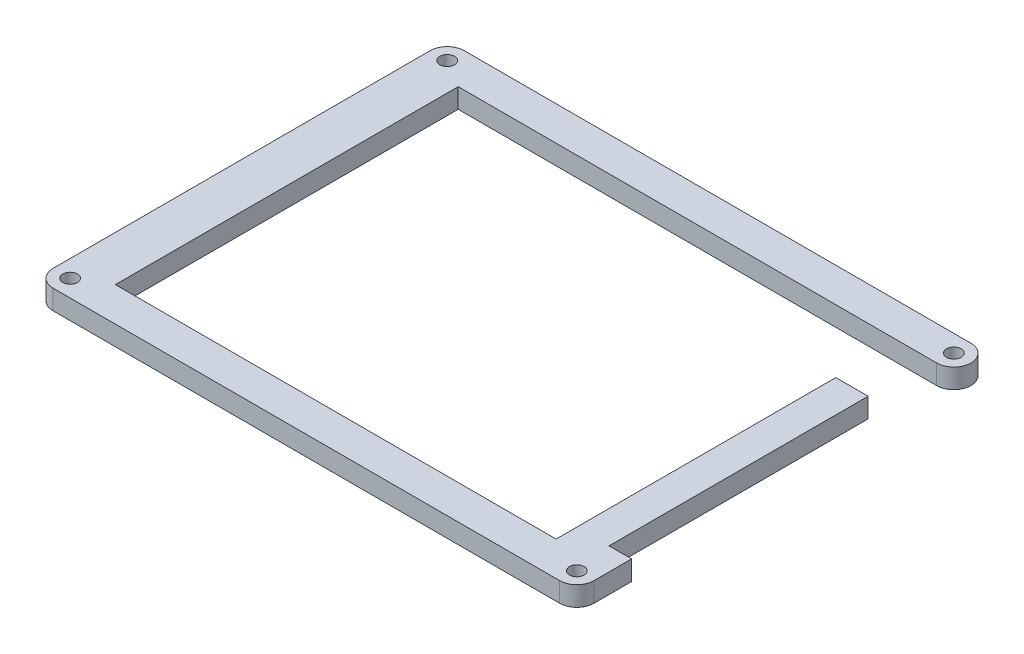
ISO-10303-21;
HEADER;
FILE_DESCRIPTION(('STEP AP214'),'2;1');
FILE_NAME('part.step','',(''),(''),'','','');
FILE_SCHEMA(('AUTOMOTIVE_DESIGN { 1 0 10303 214 1 1 1 1 }'));
ENDSEC;
DATA;
#1=APPLICATION_CONTEXT('core data for automotive mechanical design processes');
#2=APPLICATION_PROTOCOL_DEFINITION('international standard','automotive_design',2000,#1);
#3=PRODUCT_CONTEXT('',#1,'mechanical');
#4=PRODUCT('Part','Part','',(#3));
#5=PRODUCT_RELATED_PRODUCT_CATEGORY('part','',(#4));
#6=PRODUCT_DEFINITION_FORMATION('','',#4);
#7=PRODUCT_DEFINITION_CONTEXT('part definition',#1,'design');
#8=PRODUCT_DEFINITION('design','',#6,#7);
#9=PRODUCT_DEFINITION_SHAPE('','',#8);
#10=(LENGTH_UNIT() NAMED_UNIT(*) SI_UNIT(.MILLI.,.METRE.));
#11=(NAMED_UNIT(*) PLANE_ANGLE_UNIT() SI_UNIT($,.RADIAN.));
#12=(NAMED_UNIT(*) SI_UNIT($,.STERADIAN.) SOLID_ANGLE_UNIT());
#13=UNCERTAINTY_MEASURE_WITH_UNIT(LENGTH_MEASURE(1.E-05),#10,'distance_accuracy_value','');
#14=(GEOMETRIC_REPRESENTATION_CONTEXT(3) GLOBAL_UNCERTAINTY_ASSIGNED_CONTEXT((#13)) GLOBAL_UNIT_ASSIGNED_CONTEXT((#10,
#11,#12)) REPRESENTATION_CONTEXT('',''));
#15=CARTESIAN_POINT('',(0.,0.,0.));
#16=DIRECTION('',(0.,0.,1.));
#17=DIRECTION('',(1.,0.,0.));
#18=AXIS2_PLACEMENT_3D('',#15,#16,#17);
#19=CARTESIAN_POINT('',(40.9956,1.5875,61.0108));
#20=DIRECTION('',(0.,-1.,0.));
#21=DIRECTION('',(0.,0.,-1.));
#22=AXIS2_PLACEMENT_3D('',#19,#20,#21);
#23=CYLINDRICAL_SURFACE('',#22,2.7686);
#24=DIRECTION('',(0.,1.,0.));
#25=VECTOR('',#24,1.);
#26=CARTESIAN_POINT('',(43.7642,-1.5875,61.0108));
#27=LINE('',#26,#25);
#28=CARTESIAN_POINT('',(43.7642,-1.5875,61.0108));
#29=VERTEX_POINT('',#28);
#30=CARTESIAN_POINT('',(43.7642,1.5875,61.0108));
#31=VERTEX_POINT('',#30);
#32=EDGE_CURVE('E180',#29,#31,#27,.T.);
#33=ORIENTED_EDGE('',*,*,#32,.T.);
#34=CARTESIAN_POINT('',(40.9956,1.5875,61.0108));
#35=DIRECTION('',(0.,1.,0.));
#36=DIRECTION('',(0.,0.,1.));
#37=AXIS2_PLACEMENT_3D('',#34,#35,#36);
#38=CIRCLE('',#37,2.7686);
#39=CARTESIAN_POINT('',(40.9956,1.5875,63.7794));
#40=VERTEX_POINT('',#39);
#41=EDGE_CURVE('E204',#40,#31,#38,.T.);
#42=ORIENTED_EDGE('',*,*,#41,.F.);
#43=DIRECTION('',(0.,-1.,0.));
#44=VECTOR('',#43,1.);
#45=CARTESIAN_POINT('',(40.9956,1.5875,63.7794));
#46=LINE('',#45,#44);
#47=CARTESIAN_POINT('',(40.9956,-1.5875,63.7794));
#48=VERTEX_POINT('',#47);
#49=EDGE_CURVE('E209',#40,#48,#46,.T.);
#50=ORIENTED_EDGE('',*,*,#49,.T.);
#51=CARTESIAN_POINT('',(40.9956,-1.5875,61.0108));
#52=DIRECTION('',(0.,1.,0.));
#53=DIRECTION('',(0.,0.,1.));
#54=AXIS2_PLACEMENT_3D('',#51,#52,#53);
#55=CIRCLE('',#54,2.7686);
#56=EDGE_CURVE('E213',#48,#29,#55,.T.);
#57=ORIENTED_EDGE('',*,*,#56,.T.);
#58=EDGE_LOOP('',(#33,#42,#50,#57));
#59=FACE_BOUND('',#58,.T.);
#60=ADVANCED_FACE('F32',(#59),#23,.T.);
#61=CARTESIAN_POINT('',(-40.9956,1.5875,0.));
#62=DIRECTION('',(0.,-1.,0.));
#63=DIRECTION('',(0.,0.,-1.));
#64=AXIS2_PLACEMENT_3D('',#61,#62,#63);
#65=CYLINDRICAL_SURFACE('',#64,2.7686);
#66=DIRECTION('',(0.,1.,0.));
#67=VECTOR('',#66,1.);
#68=CARTESIAN_POINT('',(-43.7642,-1.5875,0.));
#69=LINE('',#68,#67);
#70=CARTESIAN_POINT('',(-43.7642,-1.5875,0.));
#71=VERTEX_POINT('',#70);
#72=CARTESIAN_POINT('',(-43.7642,1.5875,0.));
#73=VERTEX_POINT('',#72);
#74=EDGE_CURVE('E232',#71,#73,#69,.T.);
#75=ORIENTED_EDGE('',*,*,#74,.T.);
#76=CARTESIAN_POINT('',(-40.9956,1.5875,0.));
#77=DIRECTION('',(0.,1.,0.));
#78=DIRECTION('',(0.,0.,1.));
#79=AXIS2_PLACEMENT_3D('',#76,#77,#78);
#80=CIRCLE('',#79,2.7686);
#81=CARTESIAN_POINT('',(-40.9956,1.5875,-2.7686));
#82=VERTEX_POINT('',#81);
#83=EDGE_CURVE('E254',#82,#73,#80,.T.);
#84=ORIENTED_EDGE('',*,*,#83,.F.);
#85=DIRECTION('',(0.,-1.,0.));
#86=VECTOR('',#85,1.);
#87=CARTESIAN_POINT('',(-40.9956,1.5875,-2.7686));
#88=LINE('',#87,#86);
#89=CARTESIAN_POINT('',(-40.9956,-1.5875,-2.7686));
#90=VERTEX_POINT('',#89);
#91=EDGE_CURVE('E264',#82,#90,#88,.T.);
#92=ORIENTED_EDGE('',*,*,#91,.T.);
#93=CARTESIAN_POINT('',(-40.9956,-1.5875,0.));
#94=DIRECTION('',(0.,1.,0.));
#95=DIRECTION('',(0.,0.,1.));
#96=AXIS2_PLACEMENT_3D('',#93,#94,#95);
#97=CIRCLE('',#96,2.7686);
#98=EDGE_CURVE('E251',#90,#71,#97,.T.);
#99=ORIENTED_EDGE('',*,*,#98,.T.);
#100=EDGE_LOOP('',(#75,#84,#92,#99));
#101=FACE_BOUND('',#100,.T.);
#102=ADVANCED_FACE('F34',(#101),#65,.T.);
#103=CARTESIAN_POINT('',(40.9956,1.5875,2.76859999999999));
#104=DIRECTION('',(0.,0.,-1.));
#105=DIRECTION('',(-1.,0.,0.));
#106=AXIS2_PLACEMENT_3D('',#103,#104,#105);
#107=PLANE('',#106);
#108=DIRECTION('',(0.,1.,0.));
#109=VECTOR('',#108,1.);
#110=CARTESIAN_POINT('',(-36.4447225917768,-1.5875,2.7686));
#111=LINE('',#110,#109);
#112=CARTESIAN_POINT('',(-36.4447225917768,-1.5875,2.7686));
#113=VERTEX_POINT('',#112);
#114=CARTESIAN_POINT('',(-36.4447225917768,1.5875,2.7686));
#115=VERTEX_POINT('',#114);
#116=EDGE_CURVE('E236',#113,#115,#111,.T.);
#117=ORIENTED_EDGE('',*,*,#116,.F.);
#118=DIRECTION('',(1.,0.,0.));
#119=VECTOR('',#118,1.);
#120=CARTESIAN_POINT('',(40.9956,-1.5875,2.76859999999999));
#121=LINE('',#120,#119);
#122=CARTESIAN_POINT('',(40.9956,-1.5875,2.76859999999999));
#123=VERTEX_POINT('',#122);
#124=EDGE_CURVE('E267',#113,#123,#121,.T.);
#125=ORIENTED_EDGE('',*,*,#124,.T.);
#126=DIRECTION('',(0.,-1.,0.));
#127=VECTOR('',#126,1.);
#128=CARTESIAN_POINT('',(40.9956,1.5875,2.76859999999999));
#129=LINE('',#128,#127);
#130=CARTESIAN_POINT('',(40.9956,1.5875,2.76859999999999));
#131=VERTEX_POINT('',#130);
#132=EDGE_CURVE('E11',#131,#123,#129,.T.);
#133=ORIENTED_EDGE('',*,*,#132,.F.);
#134=DIRECTION('',(1.,0.,0.));
#135=VECTOR('',#134,1.);
#136=CARTESIAN_POINT('',(40.9956,1.5875,2.76859999999999));
#137=LINE('',#136,#135);
#138=EDGE_CURVE('E257',#115,#131,#137,.T.);
#139=ORIENTED_EDGE('',*,*,#138,.F.);
#140=EDGE_LOOP('',(#117,#125,#133,#139));
#141=FACE_BOUND('',#140,.T.);
#142=ADVANCED_FACE('F297',(#141),#107,.F.);
#143=CARTESIAN_POINT('',(-40.9956,1.5875,0.));
#144=DIRECTION('',(0.,1.,0.));
#145=DIRECTION('',(0.,0.,1.));
#146=AXIS2_PLACEMENT_3D('',#143,#144,#145);
#147=PLANE('',#146);
#148=DIRECTION('',(1.,0.,0.));
#149=VECTOR('',#148,1.);
#150=CARTESIAN_POINT('',(43.7642,1.5875,54.9127871837865));
#151=LINE('',#150,#149);
#152=CARTESIAN_POINT('',(40.1080456061054,1.5875,54.9127871837865));
#153=VERTEX_POINT('',#152);
#154=CARTESIAN_POINT('',(43.7642,1.5875,54.9127871837865));
#155=VERTEX_POINT('',#154);
#156=EDGE_CURVE('E47',#153,#155,#151,.T.);
#157=ORIENTED_EDGE('',*,*,#156,.F.);
#158=DIRECTION('',(0.,0.,1.));
#159=VECTOR('',#158,1.);
#160=CARTESIAN_POINT('',(40.1080456061054,1.5875,12.9794));
#161=LINE('',#160,#159);
#162=CARTESIAN_POINT('',(40.1080456061054,1.5875,12.9794));
#163=VERTEX_POINT('',#162);
#164=EDGE_CURVE('E308',#163,#153,#161,.T.);
#165=ORIENTED_EDGE('',*,*,#164,.F.);
#166=DIRECTION('',(-1.,0.,0.));
#167=VECTOR('',#166,1.);
#168=CARTESIAN_POINT('',(0.,1.5875,12.9794));
#169=LINE('',#168,#167);
#170=CARTESIAN_POINT('',(34.8742,1.5875,12.9794));
#171=VERTEX_POINT('',#170);
#172=EDGE_CURVE('E157',#163,#171,#169,.T.);
#173=ORIENTED_EDGE('',*,*,#172,.T.);
#174=DIRECTION('',(0.,0.,1.));
#175=VECTOR('',#174,1.);
#176=CARTESIAN_POINT('',(34.8742,1.5875,0.));
#177=LINE('',#176,#175);
#178=CARTESIAN_POINT('',(34.8742,1.5875,58.2422));
#179=VERTEX_POINT('',#178);
#180=EDGE_CURVE('E169',#171,#179,#177,.T.);
#181=ORIENTED_EDGE('',*,*,#180,.T.);
#182=DIRECTION('',(-1.,0.,0.));
#183=VECTOR('',#182,1.);
#184=CARTESIAN_POINT('',(-40.9956,1.5875,58.2422));
#185=LINE('',#184,#183);
#186=CARTESIAN_POINT('',(-36.4447225917768,1.5875,58.2422));
#187=VERTEX_POINT('',#186);
#188=EDGE_CURVE('E207',#179,#187,#185,.T.);
#189=ORIENTED_EDGE('',*,*,#188,.T.);
#190=DIRECTION('',(0.,0.,1.));
#191=VECTOR('',#190,1.);
#192=CARTESIAN_POINT('',(-36.4447225917768,1.5875,0.));
#193=LINE('',#192,#191);
#194=EDGE_CURVE('E55',#115,#187,#193,.T.);
#195=ORIENTED_EDGE('',*,*,#194,.F.);
#196=ORIENTED_EDGE('',*,*,#138,.T.);
#197=CARTESIAN_POINT('',(40.9956,1.5875,0.));
#198=DIRECTION('',(0.,1.,0.));
#199=DIRECTION('',(0.,0.,1.));
#200=AXIS2_PLACEMENT_3D('',#197,#198,#199);
#201=CIRCLE('',#200,2.76859999999999);
#202=CARTESIAN_POINT('',(40.9956,1.5875,-2.76859999999999));
#203=VERTEX_POINT('',#202);
#204=EDGE_CURVE('E260',#131,#203,#201,.T.);
#205=ORIENTED_EDGE('',*,*,#204,.T.);
#206=DIRECTION('',(-1.,0.,0.));
#207=VECTOR('',#206,1.);
#208=CARTESIAN_POINT('',(-40.9956,1.5875,-2.7686));
#209=LINE('',#208,#207);
#210=EDGE_CURVE('E262',#203,#82,#209,.T.);
#211=ORIENTED_EDGE('',*,*,#210,.T.);
#212=ORIENTED_EDGE('',*,*,#83,.T.);
#213=DIRECTION('',(0.,0.,1.));
#214=VECTOR('',#213,1.);
#215=CARTESIAN_POINT('',(-43.7642,1.5875,0.));
#216=LINE('',#215,#214);
#217=CARTESIAN_POINT('',(-43.7642,1.5875,61.0108));
#218=VERTEX_POINT('',#217);
#219=EDGE_CURVE('E222',#73,#218,#216,.T.);
#220=ORIENTED_EDGE('',*,*,#219,.T.);
#221=CARTESIAN_POINT('',(-40.9956,1.5875,61.0108));
#222=DIRECTION('',(0.,1.,0.));
#223=DIRECTION('',(0.,0.,1.));
#224=AXIS2_PLACEMENT_3D('',#221,#222,#223);
#225=CIRCLE('',#224,2.76860000000001);
#226=CARTESIAN_POINT('',(-40.9956,1.5875,63.7794));
#227=VERTEX_POINT('',#226);
#228=EDGE_CURVE('E199',#218,#227,#225,.T.);
#229=ORIENTED_EDGE('',*,*,#228,.T.);
#230=DIRECTION('',(1.,0.,0.));
#231=VECTOR('',#230,1.);
#232=CARTESIAN_POINT('',(40.9956,1.5875,63.7794));
#233=LINE('',#232,#231);
#234=EDGE_CURVE('E201',#227,#40,#233,.T.);
#235=ORIENTED_EDGE('',*,*,#234,.T.);
#236=ORIENTED_EDGE('',*,*,#41,.T.);
#237=DIRECTION('',(0.,0.,-1.));
#238=VECTOR('',#237,1.);
#239=CARTESIAN_POINT('',(43.7642,1.5875,0.));
#240=LINE('',#239,#238);
#241=EDGE_CURVE('E164',#31,#155,#240,.T.);
#242=ORIENTED_EDGE('',*,*,#241,.T.);
#243=EDGE_LOOP('',(#157,#165,#173,#181,#189,#195,#196,#205,#211,#212,#220,#229,#235,#236,#242));
#244=FACE_BOUND('',#243,.T.);
#245=CARTESIAN_POINT('',(-40.9956,1.5875,0.));
#246=DIRECTION('',(0.,1.,0.));
#247=DIRECTION('',(0.,0.,1.));
#248=AXIS2_PLACEMENT_3D('',#245,#246,#247);
#249=CIRCLE('',#248,1.1938);
#250=CARTESIAN_POINT('',(-40.9956,1.5875,1.1938));
#251=VERTEX_POINT('',#250);
#252=EDGE_CURVE('E248',#251,#251,#249,.T.);
#253=ORIENTED_EDGE('',*,*,#252,.F.);
#254=EDGE_LOOP('',(#253));
#255=FACE_BOUND('',#254,.T.);
#256=CARTESIAN_POINT('',(40.9956,1.5875,0.));
#257=DIRECTION('',(0.,1.,0.));
#258=DIRECTION('',(0.,0.,1.));
#259=AXIS2_PLACEMENT_3D('',#256,#257,#258);
#260=CIRCLE('',#259,1.1938);
#261=CARTESIAN_POINT('',(40.9956,1.5875,1.1938));
#262=VERTEX_POINT('',#261);
#263=EDGE_CURVE('E242',#262,#262,#260,.T.);
#264=ORIENTED_EDGE('',*,*,#263,.F.);
#265=EDGE_LOOP('',(#264));
#266=FACE_BOUND('',#265,.T.);
#267=CARTESIAN_POINT('',(-40.9956,1.5875,61.0108));
#268=DIRECTION('',(0.,1.,0.));
#269=DIRECTION('',(0.,0.,1.));
#270=AXIS2_PLACEMENT_3D('',#267,#268,#269);
#271=CIRCLE('',#270,1.1938);
#272=CARTESIAN_POINT('',(-40.9956,1.5875,62.2046));
#273=VERTEX_POINT('',#272);
#274=EDGE_CURVE('E193',#273,#273,#271,.T.);
#275=ORIENTED_EDGE('',*,*,#274,.F.);
#276=EDGE_LOOP('',(#275));
#277=FACE_BOUND('',#276,.T.);
#278=CARTESIAN_POINT('',(40.9956,1.5875,61.0108));
#279=DIRECTION('',(0.,1.,0.));
#280=DIRECTION('',(0.,0.,1.));
#281=AXIS2_PLACEMENT_3D('',#278,#279,#280);
#282=CIRCLE('',#281,1.1938);
#283=CARTESIAN_POINT('',(40.9956,1.5875,62.2046));
#284=VERTEX_POINT('',#283);
#285=EDGE_CURVE('E187',#284,#284,#282,.T.);
#286=ORIENTED_EDGE('',*,*,#285,.F.);
#287=EDGE_LOOP('',(#286));
#288=FACE_BOUND('',#287,.T.);
#289=ADVANCED_FACE('F289',(#244,#255,#266,#277,#288),#147,.T.);
#290=CARTESIAN_POINT('',(-40.9956,-1.5875,0.));
#291=DIRECTION('',(0.,1.,0.));
#292=DIRECTION('',(0.,0.,1.));
#293=AXIS2_PLACEMENT_3D('',#290,#291,#292);
#294=PLANE('',#293);
#295=DIRECTION('',(0.,0.,1.));
#296=VECTOR('',#295,1.);
#297=CARTESIAN_POINT('',(40.1080456061054,-1.5875,12.9794));
#298=LINE('',#297,#296);
#299=CARTESIAN_POINT('',(40.1080456061054,-1.5875,12.9794));
#300=VERTEX_POINT('',#299);
#301=CARTESIAN_POINT('',(40.1080456061054,-1.5875,54.9127871837865));
#302=VERTEX_POINT('',#301);
#303=EDGE_CURVE('E138',#300,#302,#298,.T.);
#304=ORIENTED_EDGE('',*,*,#303,.T.);
#305=DIRECTION('',(1.,0.,0.));
#306=VECTOR('',#305,1.);
#307=CARTESIAN_POINT('',(43.7642,-1.5875,54.9127871837865));
#308=LINE('',#307,#306);
#309=CARTESIAN_POINT('',(43.7642,-1.5875,54.9127871837865));
#310=VERTEX_POINT('',#309);
#311=EDGE_CURVE('E149',#302,#310,#308,.T.);
#312=ORIENTED_EDGE('',*,*,#311,.T.);
#313=DIRECTION('',(0.,0.,-1.));
#314=VECTOR('',#313,1.);
#315=CARTESIAN_POINT('',(43.7642,-1.5875,0.));
#316=LINE('',#315,#314);
#317=EDGE_CURVE('E166',#29,#310,#316,.T.);
#318=ORIENTED_EDGE('',*,*,#317,.F.);
#319=ORIENTED_EDGE('',*,*,#56,.F.);
#320=DIRECTION('',(1.,0.,0.));
#321=VECTOR('',#320,1.);
#322=CARTESIAN_POINT('',(40.9956,-1.5875,63.7794));
#323=LINE('',#322,#321);
#324=CARTESIAN_POINT('',(-40.9956,-1.5875,63.7794));
#325=VERTEX_POINT('',#324);
#326=EDGE_CURVE('E211',#325,#48,#323,.T.);
#327=ORIENTED_EDGE('',*,*,#326,.F.);
#328=CARTESIAN_POINT('',(-40.9956,-1.5875,61.0108));
#329=DIRECTION('',(0.,1.,0.));
#330=DIRECTION('',(0.,0.,1.));
#331=AXIS2_PLACEMENT_3D('',#328,#329,#330);
#332=CIRCLE('',#331,2.76860000000001);
#333=CARTESIAN_POINT('',(-43.7642,-1.5875,61.0108));
#334=VERTEX_POINT('',#333);
#335=EDGE_CURVE('E196',#334,#325,#332,.T.);
#336=ORIENTED_EDGE('',*,*,#335,.F.);
#337=DIRECTION('',(0.,0.,1.));
#338=VECTOR('',#337,1.);
#339=CARTESIAN_POINT('',(-43.7642,-1.5875,0.));
#340=LINE('',#339,#338);
#341=EDGE_CURVE('E223',#71,#334,#340,.T.);
#342=ORIENTED_EDGE('',*,*,#341,.F.);
#343=ORIENTED_EDGE('',*,*,#98,.F.);
#344=DIRECTION('',(-1.,0.,0.));
#345=VECTOR('',#344,1.);
#346=CARTESIAN_POINT('',(-40.9956,-1.5875,-2.7686));
#347=LINE('',#346,#345);
#348=CARTESIAN_POINT('',(40.9956,-1.5875,-2.76859999999999));
#349=VERTEX_POINT('',#348);
#350=EDGE_CURVE('E258',#349,#90,#347,.T.);
#351=ORIENTED_EDGE('',*,*,#350,.F.);
#352=CARTESIAN_POINT('',(40.9956,-1.5875,0.));
#353=DIRECTION('',(0.,1.,0.));
#354=DIRECTION('',(0.,0.,1.));
#355=AXIS2_PLACEMENT_3D('',#352,#353,#354);
#356=CIRCLE('',#355,2.76859999999999);
#357=EDGE_CURVE('E269',#123,#349,#356,.T.);
#358=ORIENTED_EDGE('',*,*,#357,.F.);
#359=ORIENTED_EDGE('',*,*,#124,.F.);
#360=DIRECTION('',(0.,0.,1.));
#361=VECTOR('',#360,1.);
#362=CARTESIAN_POINT('',(-36.4447225917768,-1.5875,0.));
#363=LINE('',#362,#361);
#364=CARTESIAN_POINT('',(-36.4447225917768,-1.5875,58.2422));
#365=VERTEX_POINT('',#364);
#366=EDGE_CURVE('E225',#113,#365,#363,.T.);
#367=ORIENTED_EDGE('',*,*,#366,.T.);
#368=DIRECTION('',(-1.,0.,0.));
#369=VECTOR('',#368,1.);
#370=CARTESIAN_POINT('',(-40.9956,-1.5875,58.2422));
#371=LINE('',#370,#369);
#372=CARTESIAN_POINT('',(34.8742,-1.5875,58.2422));
#373=VERTEX_POINT('',#372);
#374=EDGE_CURVE('E202',#373,#365,#371,.T.);
#375=ORIENTED_EDGE('',*,*,#374,.F.);
#376=DIRECTION('',(0.,0.,1.));
#377=VECTOR('',#376,1.);
#378=CARTESIAN_POINT('',(34.8742,-1.5875,0.));
#379=LINE('',#378,#377);
#380=CARTESIAN_POINT('',(34.8742,-1.5875,12.9794));
#381=VERTEX_POINT('',#380);
#382=EDGE_CURVE('E163',#381,#373,#379,.T.);
#383=ORIENTED_EDGE('',*,*,#382,.F.);
#384=DIRECTION('',(-1.,0.,0.));
#385=VECTOR('',#384,1.);
#386=CARTESIAN_POINT('',(0.,-1.5875,12.9794));
#387=LINE('',#386,#385);
#388=EDGE_CURVE('E155',#300,#381,#387,.T.);
#389=ORIENTED_EDGE('',*,*,#388,.F.);
#390=EDGE_LOOP('',(#304,#312,#318,#319,#327,#336,#342,#343,#351,#358,#359,#367,#375,#383,#389));
#391=FACE_BOUND('',#390,.T.);
#392=CARTESIAN_POINT('',(-40.9956,-1.5875,0.));
#393=DIRECTION('',(0.,1.,0.));
#394=DIRECTION('',(0.,0.,1.));
#395=AXIS2_PLACEMENT_3D('',#392,#393,#394);
#396=CIRCLE('',#395,1.1938);
#397=CARTESIAN_POINT('',(-40.9956,-1.5875,1.1938));
#398=VERTEX_POINT('',#397);
#399=EDGE_CURVE('E245',#398,#398,#396,.T.);
#400=ORIENTED_EDGE('',*,*,#399,.T.);
#401=EDGE_LOOP('',(#400));
#402=FACE_BOUND('',#401,.T.);
#403=CARTESIAN_POINT('',(40.9956,-1.5875,0.));
#404=DIRECTION('',(0.,1.,0.));
#405=DIRECTION('',(0.,0.,1.));
#406=AXIS2_PLACEMENT_3D('',#403,#404,#405);
#407=CIRCLE('',#406,1.1938);
#408=CARTESIAN_POINT('',(40.9956,-1.5875,1.1938));
#409=VERTEX_POINT('',#408);
#410=EDGE_CURVE('E235',#409,#409,#407,.T.);
#411=ORIENTED_EDGE('',*,*,#410,.T.);
#412=EDGE_LOOP('',(#411));
#413=FACE_BOUND('',#412,.T.);
#414=CARTESIAN_POINT('',(-40.9956,-1.5875,61.0108));
#415=DIRECTION('',(0.,1.,0.));
#416=DIRECTION('',(0.,0.,1.));
#417=AXIS2_PLACEMENT_3D('',#414,#415,#416);
#418=CIRCLE('',#417,1.1938);
#419=CARTESIAN_POINT('',(-40.9956,-1.5875,62.2046));
#420=VERTEX_POINT('',#419);
#421=EDGE_CURVE('E190',#420,#420,#418,.T.);
#422=ORIENTED_EDGE('',*,*,#421,.T.);
#423=EDGE_LOOP('',(#422));
#424=FACE_BOUND('',#423,.T.);
#425=CARTESIAN_POINT('',(40.9956,-1.5875,61.0108));
#426=DIRECTION('',(0.,1.,0.));
#427=DIRECTION('',(0.,0.,1.));
#428=AXIS2_PLACEMENT_3D('',#425,#426,#427);
#429=CIRCLE('',#428,1.1938);
#430=CARTESIAN_POINT('',(40.9956,-1.5875,62.2046));
#431=VERTEX_POINT('',#430);
#432=EDGE_CURVE('E183',#431,#431,#429,.T.);
#433=ORIENTED_EDGE('',*,*,#432,.T.);
#434=EDGE_LOOP('',(#433));
#435=FACE_BOUND('',#434,.T.);
#436=ADVANCED_FACE('F160',(#391,#402,#413,#424,#435),#294,.F.);
#437=CARTESIAN_POINT('',(40.9956,1.5875,0.));
#438=DIRECTION('',(0.,-1.,0.));
#439=DIRECTION('',(0.,0.,-1.));
#440=AXIS2_PLACEMENT_3D('',#437,#438,#439);
#441=CYLINDRICAL_SURFACE('',#440,2.76859999999999);
#442=ORIENTED_EDGE('',*,*,#357,.T.);
#443=DIRECTION('',(0.,-1.,0.));
#444=VECTOR('',#443,1.);
#445=CARTESIAN_POINT('',(40.9956,1.5875,-2.76859999999999));
#446=LINE('',#445,#444);
#447=EDGE_CURVE('E40',#203,#349,#446,.T.);
#448=ORIENTED_EDGE('',*,*,#447,.F.);
#449=ORIENTED_EDGE('',*,*,#204,.F.);
#450=ORIENTED_EDGE('',*,*,#132,.T.);
#451=EDGE_LOOP('',(#442,#448,#449,#450));
#452=FACE_BOUND('',#451,.T.);
#453=ADVANCED_FACE('F294',(#452),#441,.T.);
#454=CARTESIAN_POINT('',(-40.9956,1.5875,-2.7686));
#455=DIRECTION('',(0.,0.,1.));
#456=DIRECTION('',(1.,0.,0.));
#457=AXIS2_PLACEMENT_3D('',#454,#455,#456);
#458=PLANE('',#457);
#459=ORIENTED_EDGE('',*,*,#350,.T.);
#460=ORIENTED_EDGE('',*,*,#91,.F.);
#461=ORIENTED_EDGE('',*,*,#210,.F.);
#462=ORIENTED_EDGE('',*,*,#447,.T.);
#463=EDGE_LOOP('',(#459,#460,#461,#462));
#464=FACE_BOUND('',#463,.T.);
#465=ADVANCED_FACE('F278',(#464),#458,.F.);
#466=CARTESIAN_POINT('',(-40.9956,1.5875,0.));
#467=DIRECTION('',(0.,-1.,0.));
#468=DIRECTION('',(0.,0.,-1.));
#469=AXIS2_PLACEMENT_3D('',#466,#467,#468);
#470=CYLINDRICAL_SURFACE('',#469,1.1938);
#471=ORIENTED_EDGE('',*,*,#252,.T.);
#472=EDGE_LOOP('',(#471));
#473=FACE_BOUND('',#472,.T.);
#474=ORIENTED_EDGE('',*,*,#399,.F.);
#475=EDGE_LOOP('',(#474));
#476=FACE_BOUND('',#475,.T.);
#477=ADVANCED_FACE('F339',(#473,#476),#470,.F.);
#478=CARTESIAN_POINT('',(40.9956,1.5875,0.));
#479=DIRECTION('',(0.,-1.,0.));
#480=DIRECTION('',(0.,0.,-1.));
#481=AXIS2_PLACEMENT_3D('',#478,#479,#480);
#482=CYLINDRICAL_SURFACE('',#481,1.1938);
#483=ORIENTED_EDGE('',*,*,#263,.T.);
#484=EDGE_LOOP('',(#483));
#485=FACE_BOUND('',#484,.T.);
#486=ORIENTED_EDGE('',*,*,#410,.F.);
#487=EDGE_LOOP('',(#486));
#488=FACE_BOUND('',#487,.T.);
#489=ADVANCED_FACE('F332',(#485,#488),#482,.F.);
#490=CARTESIAN_POINT('',(-43.7642,-1.5875,0.));
#491=DIRECTION('',(-1.,0.,0.));
#492=DIRECTION('',(0.,0.,1.));
#493=AXIS2_PLACEMENT_3D('',#490,#491,#492);
#494=PLANE('',#493);
#495=ORIENTED_EDGE('',*,*,#219,.F.);
#496=ORIENTED_EDGE('',*,*,#74,.F.);
#497=ORIENTED_EDGE('',*,*,#341,.T.);
#498=DIRECTION('',(0.,1.,0.));
#499=VECTOR('',#498,1.);
#500=CARTESIAN_POINT('',(-43.7642,-1.5875,61.0108));
#501=LINE('',#500,#499);
#502=EDGE_CURVE('E228',#334,#218,#501,.T.);
#503=ORIENTED_EDGE('',*,*,#502,.T.);
#504=EDGE_LOOP('',(#495,#496,#497,#503));
#505=FACE_BOUND('',#504,.T.);
#506=ADVANCED_FACE('F330',(#505),#494,.T.);
#507=CARTESIAN_POINT('',(-36.4447225917768,-1.5875,0.));
#508=DIRECTION('',(-1.,0.,0.));
#509=DIRECTION('',(0.,0.,1.));
#510=AXIS2_PLACEMENT_3D('',#507,#508,#509);
#511=PLANE('',#510);
#512=ORIENTED_EDGE('',*,*,#194,.T.);
#513=DIRECTION('',(0.,1.,0.));
#514=VECTOR('',#513,1.);
#515=CARTESIAN_POINT('',(-36.4447225917768,-1.5875,58.2422));
#516=LINE('',#515,#514);
#517=EDGE_CURVE('E238',#365,#187,#516,.T.);
#518=ORIENTED_EDGE('',*,*,#517,.F.);
#519=ORIENTED_EDGE('',*,*,#366,.F.);
#520=ORIENTED_EDGE('',*,*,#116,.T.);
#521=EDGE_LOOP('',(#512,#518,#519,#520));
#522=FACE_BOUND('',#521,.T.);
#523=ADVANCED_FACE('F300',(#522),#511,.F.);
#524=CARTESIAN_POINT('',(-40.9956,1.5875,58.2422));
#525=DIRECTION('',(0.,0.,1.));
#526=DIRECTION('',(1.,0.,0.));
#527=AXIS2_PLACEMENT_3D('',#524,#525,#526);
#528=PLANE('',#527);
#529=ORIENTED_EDGE('',*,*,#188,.F.);
#530=DIRECTION('',(0.,1.,0.));
#531=VECTOR('',#530,1.);
#532=CARTESIAN_POINT('',(34.8742,-1.5875,58.2422));
#533=LINE('',#532,#531);
#534=EDGE_CURVE('E184',#373,#179,#533,.T.);
#535=ORIENTED_EDGE('',*,*,#534,.F.);
#536=ORIENTED_EDGE('',*,*,#374,.T.);
#537=ORIENTED_EDGE('',*,*,#517,.T.);
#538=EDGE_LOOP('',(#529,#535,#536,#537));
#539=FACE_BOUND('',#538,.T.);
#540=ADVANCED_FACE('F303',(#539),#528,.F.);
#541=CARTESIAN_POINT('',(-40.9956,1.5875,61.0108));
#542=DIRECTION('',(0.,-1.,0.));
#543=DIRECTION('',(0.,0.,-1.));
#544=AXIS2_PLACEMENT_3D('',#541,#542,#543);
#545=CYLINDRICAL_SURFACE('',#544,2.76860000000001);
#546=ORIENTED_EDGE('',*,*,#502,.F.);
#547=ORIENTED_EDGE('',*,*,#335,.T.);
#548=DIRECTION('',(0.,-1.,0.));
#549=VECTOR('',#548,1.);
#550=CARTESIAN_POINT('',(-40.9956,1.5875,63.7794));
#551=LINE('',#550,#549);
#552=EDGE_CURVE('E219',#227,#325,#551,.T.);
#553=ORIENTED_EDGE('',*,*,#552,.F.);
#554=ORIENTED_EDGE('',*,*,#228,.F.);
#555=EDGE_LOOP('',(#546,#547,#553,#554));
#556=FACE_BOUND('',#555,.T.);
#557=ADVANCED_FACE('F328',(#556),#545,.T.);
#558=CARTESIAN_POINT('',(40.9956,1.5875,63.7794));
#559=DIRECTION('',(0.,0.,-1.));
#560=DIRECTION('',(-1.,0.,0.));
#561=AXIS2_PLACEMENT_3D('',#558,#559,#560);
#562=PLANE('',#561);
#563=ORIENTED_EDGE('',*,*,#326,.T.);
#564=ORIENTED_EDGE('',*,*,#49,.F.);
#565=ORIENTED_EDGE('',*,*,#234,.F.);
#566=ORIENTED_EDGE('',*,*,#552,.T.);
#567=EDGE_LOOP('',(#563,#564,#565,#566));
#568=FACE_BOUND('',#567,.T.);
#569=ADVANCED_FACE('F324',(#568),#562,.F.);
#570=CARTESIAN_POINT('',(-40.9956,1.5875,61.0108));
#571=DIRECTION('',(0.,-1.,0.));
#572=DIRECTION('',(0.,0.,-1.));
#573=AXIS2_PLACEMENT_3D('',#570,#571,#572);
#574=CYLINDRICAL_SURFACE('',#573,1.1938);
#575=ORIENTED_EDGE('',*,*,#274,.T.);
#576=EDGE_LOOP('',(#575));
#577=FACE_BOUND('',#576,.T.);
#578=ORIENTED_EDGE('',*,*,#421,.F.);
#579=EDGE_LOOP('',(#578));
#580=FACE_BOUND('',#579,.T.);
#581=ADVANCED_FACE('F352',(#577,#580),#574,.F.);
#582=CARTESIAN_POINT('',(40.9956,1.5875,61.0108));
#583=DIRECTION('',(0.,-1.,0.));
#584=DIRECTION('',(0.,0.,-1.));
#585=AXIS2_PLACEMENT_3D('',#582,#583,#584);
#586=CYLINDRICAL_SURFACE('',#585,1.1938);
#587=ORIENTED_EDGE('',*,*,#285,.T.);
#588=EDGE_LOOP('',(#587));
#589=FACE_BOUND('',#588,.T.);
#590=ORIENTED_EDGE('',*,*,#432,.F.);
#591=EDGE_LOOP('',(#590));
#592=FACE_BOUND('',#591,.T.);
#593=ADVANCED_FACE('F387',(#589,#592),#586,.F.);
#594=CARTESIAN_POINT('',(0.,-1.5875,12.9794));
#595=DIRECTION('',(0.,0.,-1.));
#596=DIRECTION('',(-1.,0.,0.));
#597=AXIS2_PLACEMENT_3D('',#594,#595,#596);
#598=PLANE('',#597);
#599=DIRECTION('',(0.,1.,0.));
#600=VECTOR('',#599,1.);
#601=CARTESIAN_POINT('',(40.1080456061054,-1.5875,12.9794));
#602=LINE('',#601,#600);
#603=EDGE_CURVE('E142',#300,#163,#602,.T.);
#604=ORIENTED_EDGE('',*,*,#603,.F.);
#605=ORIENTED_EDGE('',*,*,#388,.T.);
#606=DIRECTION('',(0.,1.,0.));
#607=VECTOR('',#606,1.);
#608=CARTESIAN_POINT('',(34.8742,-1.5875,12.9794));
#609=LINE('',#608,#607);
#610=EDGE_CURVE('E175',#381,#171,#609,.T.);
#611=ORIENTED_EDGE('',*,*,#610,.T.);
#612=ORIENTED_EDGE('',*,*,#172,.F.);
#613=EDGE_LOOP('',(#604,#605,#611,#612));
#614=FACE_BOUND('',#613,.T.);
#615=ADVANCED_FACE('F153',(#614),#598,.T.);
#616=CARTESIAN_POINT('',(43.7642,-1.5875,0.));
#617=DIRECTION('',(1.,0.,0.));
#618=DIRECTION('',(0.,0.,-1.));
#619=AXIS2_PLACEMENT_3D('',#616,#617,#618);
#620=PLANE('',#619);
#621=DIRECTION('',(0.,1.,0.));
#622=VECTOR('',#621,1.);
#623=CARTESIAN_POINT('',(43.7642,-1.5875,54.9127871837865));
#624=LINE('',#623,#622);
#625=EDGE_CURVE('E177',#310,#155,#624,.T.);
#626=ORIENTED_EDGE('',*,*,#625,.T.);
#627=ORIENTED_EDGE('',*,*,#241,.F.);
#628=ORIENTED_EDGE('',*,*,#32,.F.);
#629=ORIENTED_EDGE('',*,*,#317,.T.);
#630=EDGE_LOOP('',(#626,#627,#628,#629));
#631=FACE_BOUND('',#630,.T.);
#632=ADVANCED_FACE('F317',(#631),#620,.T.);
#633=CARTESIAN_POINT('',(34.8742,-1.5875,0.));
#634=DIRECTION('',(-1.,0.,0.));
#635=DIRECTION('',(0.,0.,1.));
#636=AXIS2_PLACEMENT_3D('',#633,#634,#635);
#637=PLANE('',#636);
#638=ORIENTED_EDGE('',*,*,#180,.F.);
#639=ORIENTED_EDGE('',*,*,#610,.F.);
#640=ORIENTED_EDGE('',*,*,#382,.T.);
#641=ORIENTED_EDGE('',*,*,#534,.T.);
#642=EDGE_LOOP('',(#638,#639,#640,#641));
#643=FACE_BOUND('',#642,.T.);
#644=ADVANCED_FACE('F307',(#643),#637,.T.);
#645=CARTESIAN_POINT('',(43.7642,-1.5875,54.9127871837865));
#646=DIRECTION('',(0.,0.,1.));
#647=DIRECTION('',(1.,0.,0.));
#648=AXIS2_PLACEMENT_3D('',#645,#646,#647);
#649=PLANE('',#648);
#650=ORIENTED_EDGE('',*,*,#156,.T.);
#651=ORIENTED_EDGE('',*,*,#625,.F.);
#652=ORIENTED_EDGE('',*,*,#311,.F.);
#653=DIRECTION('',(0.,1.,0.));
#654=VECTOR('',#653,1.);
#655=CARTESIAN_POINT('',(40.1080456061054,-1.5875,54.9127871837865));
#656=LINE('',#655,#654);
#657=EDGE_CURVE('E144',#302,#153,#656,.T.);
#658=ORIENTED_EDGE('',*,*,#657,.T.);
#659=EDGE_LOOP('',(#650,#651,#652,#658));
#660=FACE_BOUND('',#659,.T.);
#661=ADVANCED_FACE('F313',(#660),#649,.F.);
#662=CARTESIAN_POINT('',(40.1080456061054,-1.5875,12.9794));
#663=DIRECTION('',(-1.,0.,0.));
#664=DIRECTION('',(0.,0.,1.));
#665=AXIS2_PLACEMENT_3D('',#662,#663,#664);
#666=PLANE('',#665);
#667=ORIENTED_EDGE('',*,*,#164,.T.);
#668=ORIENTED_EDGE('',*,*,#657,.F.);
#669=ORIENTED_EDGE('',*,*,#303,.F.);
#670=ORIENTED_EDGE('',*,*,#603,.T.);
#671=EDGE_LOOP('',(#667,#668,#669,#670));
#672=FACE_BOUND('',#671,.T.);
#673=ADVANCED_FACE('F141',(#672),#666,.F.);
#674=CLOSED_SHELL('',(#60,#102,#142,#289,#436,#453,#465,#477,#489,#506,#523,#540,#557,#569,#581,
#593,#615,#632,#644,#661,#673));
#675=MANIFOLD_SOLID_BREP('B2',#674);
#676=ADVANCED_BREP_SHAPE_REPRESENTATION('',(#18,#675),#14);
#677=SHAPE_DEFINITION_REPRESENTATION(#9,#676);
ENDSEC;
END-ISO-10303-21;
